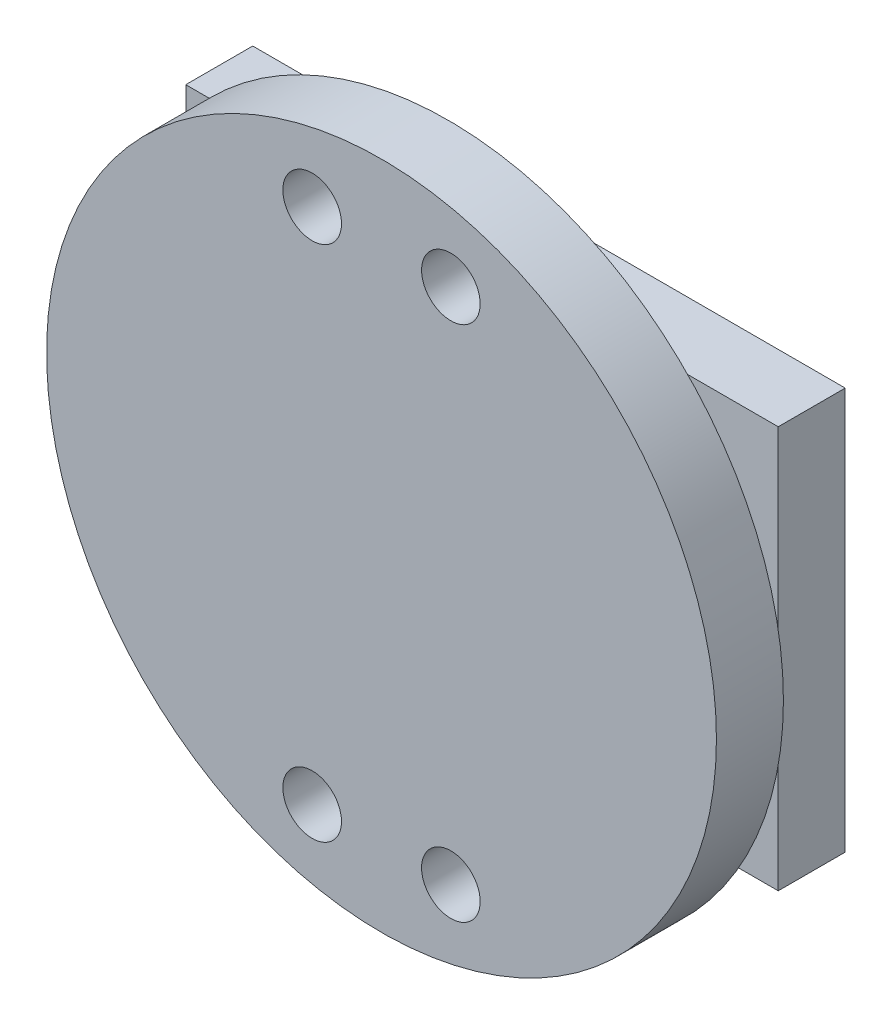
ISO-10303-21;
HEADER;
FILE_DESCRIPTION(('STEP AP214'),'2;1');
FILE_NAME('part.step','',(''),(''),'','','');
FILE_SCHEMA(('AUTOMOTIVE_DESIGN { 1 0 10303 214 1 1 1 1 }'));
ENDSEC;
DATA;
#1=APPLICATION_CONTEXT('core data for automotive mechanical design processes');
#2=APPLICATION_PROTOCOL_DEFINITION('international standard','automotive_design',2000,#1);
#3=PRODUCT_CONTEXT('',#1,'mechanical');
#4=PRODUCT('Part','Part','',(#3));
#5=PRODUCT_RELATED_PRODUCT_CATEGORY('part','',(#4));
#6=PRODUCT_DEFINITION_FORMATION('','',#4);
#7=PRODUCT_DEFINITION_CONTEXT('part definition',#1,'design');
#8=PRODUCT_DEFINITION('design','',#6,#7);
#9=PRODUCT_DEFINITION_SHAPE('','',#8);
#10=(LENGTH_UNIT() NAMED_UNIT(*) SI_UNIT(.MILLI.,.METRE.));
#11=(NAMED_UNIT(*) PLANE_ANGLE_UNIT() SI_UNIT($,.RADIAN.));
#12=(NAMED_UNIT(*) SI_UNIT($,.STERADIAN.) SOLID_ANGLE_UNIT());
#13=UNCERTAINTY_MEASURE_WITH_UNIT(LENGTH_MEASURE(1.E-05),#10,'distance_accuracy_value','');
#14=(GEOMETRIC_REPRESENTATION_CONTEXT(3) GLOBAL_UNCERTAINTY_ASSIGNED_CONTEXT((#13)) GLOBAL_UNIT_ASSIGNED_CONTEXT((#10,
#11,#12)) REPRESENTATION_CONTEXT('',''));
#15=CARTESIAN_POINT('',(0.,0.,0.));
#16=DIRECTION('',(0.,0.,1.));
#17=DIRECTION('',(1.,0.,0.));
#18=AXIS2_PLACEMENT_3D('',#15,#16,#17);
#19=CARTESIAN_POINT('',(0.,0.,4.));
#20=DIRECTION('',(1.,0.,0.));
#21=DIRECTION('',(0.,0.,-1.));
#22=AXIS2_PLACEMENT_3D('',#19,#20,#21);
#23=PLANE('',#22);
#24=DIRECTION('',(0.,-1.,0.));
#25=VECTOR('',#24,1.);
#26=CARTESIAN_POINT('',(0.,0.,0.));
#27=LINE('',#26,#25);
#28=CARTESIAN_POINT('',(0.,0.,0.));
#29=VERTEX_POINT('',#28);
#30=CARTESIAN_POINT('',(0.,-24.,0.));
#31=VERTEX_POINT('',#30);
#32=EDGE_CURVE('E101',#29,#31,#27,.T.);
#33=ORIENTED_EDGE('',*,*,#32,.T.);
#34=DIRECTION('',(0.,0.,-1.));
#35=VECTOR('',#34,1.);
#36=CARTESIAN_POINT('',(0.,-24.,4.));
#37=LINE('',#36,#35);
#38=CARTESIAN_POINT('',(0.,-24.,4.));
#39=VERTEX_POINT('',#38);
#40=EDGE_CURVE('E38',#39,#31,#37,.T.);
#41=ORIENTED_EDGE('',*,*,#40,.F.);
#42=DIRECTION('',(0.,-1.,0.));
#43=VECTOR('',#42,1.);
#44=CARTESIAN_POINT('',(0.,0.,4.));
#45=LINE('',#44,#43);
#46=CARTESIAN_POINT('',(0.,0.,4.));
#47=VERTEX_POINT('',#46);
#48=EDGE_CURVE('E88',#47,#39,#45,.T.);
#49=ORIENTED_EDGE('',*,*,#48,.F.);
#50=DIRECTION('',(0.,0.,-1.));
#51=VECTOR('',#50,1.);
#52=CARTESIAN_POINT('',(0.,0.,4.));
#53=LINE('',#52,#51);
#54=EDGE_CURVE('E97',#47,#29,#53,.T.);
#55=ORIENTED_EDGE('',*,*,#54,.T.);
#56=EDGE_LOOP('',(#33,#41,#49,#55));
#57=FACE_BOUND('',#56,.T.);
#58=ADVANCED_FACE('F35',(#57),#23,.F.);
#59=CARTESIAN_POINT('',(0.,-24.,4.));
#60=DIRECTION('',(0.,1.,0.));
#61=DIRECTION('',(0.,0.,1.));
#62=AXIS2_PLACEMENT_3D('',#59,#60,#61);
#63=PLANE('',#62);
#64=DIRECTION('',(1.,0.,0.));
#65=VECTOR('',#64,1.);
#66=CARTESIAN_POINT('',(0.,-24.,0.));
#67=LINE('',#66,#65);
#68=CARTESIAN_POINT('',(35.38,-24.,0.));
#69=VERTEX_POINT('',#68);
#70=EDGE_CURVE('E93',#31,#69,#67,.T.);
#71=ORIENTED_EDGE('',*,*,#70,.T.);
#72=DIRECTION('',(0.,0.,-1.));
#73=VECTOR('',#72,1.);
#74=CARTESIAN_POINT('',(35.38,-24.,4.));
#75=LINE('',#74,#73);
#76=CARTESIAN_POINT('',(35.38,-24.,4.));
#77=VERTEX_POINT('',#76);
#78=EDGE_CURVE('E91',#77,#69,#75,.T.);
#79=ORIENTED_EDGE('',*,*,#78,.F.);
#80=DIRECTION('',(1.,0.,0.));
#81=VECTOR('',#80,1.);
#82=CARTESIAN_POINT('',(0.,-24.,4.));
#83=LINE('',#82,#81);
#84=EDGE_CURVE('E83',#39,#77,#83,.T.);
#85=ORIENTED_EDGE('',*,*,#84,.F.);
#86=ORIENTED_EDGE('',*,*,#40,.T.);
#87=EDGE_LOOP('',(#71,#79,#85,#86));
#88=FACE_BOUND('',#87,.T.);
#89=ADVANCED_FACE('F92',(#88),#63,.F.);
#90=CARTESIAN_POINT('',(35.38,0.,4.));
#91=DIRECTION('',(-1.,0.,0.));
#92=DIRECTION('',(0.,-1.,0.));
#93=AXIS2_PLACEMENT_3D('',#90,#91,#92);
#94=PLANE('',#93);
#95=DIRECTION('',(0.,1.,0.));
#96=VECTOR('',#95,1.);
#97=CARTESIAN_POINT('',(35.38,0.,0.));
#98=LINE('',#97,#96);
#99=CARTESIAN_POINT('',(35.38,0.,0.));
#100=VERTEX_POINT('',#99);
#101=EDGE_CURVE('E69',#69,#100,#98,.T.);
#102=ORIENTED_EDGE('',*,*,#101,.T.);
#103=DIRECTION('',(0.,0.,-1.));
#104=VECTOR('',#103,1.);
#105=CARTESIAN_POINT('',(35.38,0.,4.));
#106=LINE('',#105,#104);
#107=CARTESIAN_POINT('',(35.38,0.,4.));
#108=VERTEX_POINT('',#107);
#109=EDGE_CURVE('E94',#108,#100,#106,.T.);
#110=ORIENTED_EDGE('',*,*,#109,.F.);
#111=DIRECTION('',(0.,1.,0.));
#112=VECTOR('',#111,1.);
#113=CARTESIAN_POINT('',(35.38,0.,4.));
#114=LINE('',#113,#112);
#115=EDGE_CURVE('E86',#77,#108,#114,.T.);
#116=ORIENTED_EDGE('',*,*,#115,.F.);
#117=ORIENTED_EDGE('',*,*,#78,.T.);
#118=EDGE_LOOP('',(#102,#110,#116,#117));
#119=FACE_BOUND('',#118,.T.);
#120=ADVANCED_FACE('F95',(#119),#94,.F.);
#121=CARTESIAN_POINT('',(0.,0.,4.));
#122=DIRECTION('',(0.,-1.,0.));
#123=DIRECTION('',(0.,0.,-1.));
#124=AXIS2_PLACEMENT_3D('',#121,#122,#123);
#125=PLANE('',#124);
#126=DIRECTION('',(-1.,0.,0.));
#127=VECTOR('',#126,1.);
#128=CARTESIAN_POINT('',(0.,0.,0.));
#129=LINE('',#128,#127);
#130=EDGE_CURVE('E75',#100,#29,#129,.T.);
#131=ORIENTED_EDGE('',*,*,#130,.T.);
#132=ORIENTED_EDGE('',*,*,#54,.F.);
#133=DIRECTION('',(-1.,0.,0.));
#134=VECTOR('',#133,1.);
#135=CARTESIAN_POINT('',(0.,0.,4.));
#136=LINE('',#135,#134);
#137=EDGE_CURVE('E52',#108,#47,#136,.T.);
#138=ORIENTED_EDGE('',*,*,#137,.F.);
#139=ORIENTED_EDGE('',*,*,#109,.T.);
#140=EDGE_LOOP('',(#131,#132,#138,#139));
#141=FACE_BOUND('',#140,.T.);
#142=ADVANCED_FACE('F109',(#141),#125,.F.);
#143=CARTESIAN_POINT('',(0.,0.,4.));
#144=DIRECTION('',(0.,0.,1.));
#145=DIRECTION('',(1.,0.,0.));
#146=AXIS2_PLACEMENT_3D('',#143,#144,#145);
#147=PLANE('',#146);
#148=CARTESIAN_POINT('',(17.69,-12.,4.));
#149=DIRECTION('',(0.,0.,1.));
#150=DIRECTION('',(1.,0.,0.));
#151=AXIS2_PLACEMENT_3D('',#148,#149,#150);
#152=CIRCLE('',#151,10.);
#153=CARTESIAN_POINT('',(27.69,-12.,4.));
#154=VERTEX_POINT('',#153);
#155=EDGE_CURVE('E11',#154,#154,#152,.T.);
#156=ORIENTED_EDGE('',*,*,#155,.F.);
#157=EDGE_LOOP('',(#156));
#158=FACE_BOUND('',#157,.T.);
#159=ORIENTED_EDGE('',*,*,#48,.T.);
#160=ORIENTED_EDGE('',*,*,#84,.T.);
#161=ORIENTED_EDGE('',*,*,#115,.T.);
#162=ORIENTED_EDGE('',*,*,#137,.T.);
#163=EDGE_LOOP('',(#159,#160,#161,#162));
#164=FACE_BOUND('',#163,.T.);
#165=ADVANCED_FACE('F84',(#158,#164),#147,.T.);
#166=CARTESIAN_POINT('',(0.,0.,0.));
#167=DIRECTION('',(0.,0.,1.));
#168=DIRECTION('',(1.,0.,0.));
#169=AXIS2_PLACEMENT_3D('',#166,#167,#168);
#170=PLANE('',#169);
#171=ORIENTED_EDGE('',*,*,#32,.F.);
#172=ORIENTED_EDGE('',*,*,#130,.F.);
#173=ORIENTED_EDGE('',*,*,#101,.F.);
#174=ORIENTED_EDGE('',*,*,#70,.F.);
#175=EDGE_LOOP('',(#171,#172,#173,#174));
#176=FACE_BOUND('',#175,.T.);
#177=ADVANCED_FACE('F112',(#176),#170,.F.);
#178=CARTESIAN_POINT('',(17.69,-12.,6.));
#179=DIRECTION('',(0.,0.,-1.));
#180=DIRECTION('',(-1.,0.,0.));
#181=AXIS2_PLACEMENT_3D('',#178,#179,#180);
#182=CYLINDRICAL_SURFACE('',#181,10.);
#183=CARTESIAN_POINT('',(17.69,-12.,6.));
#184=DIRECTION('',(0.,0.,1.));
#185=DIRECTION('',(1.,0.,0.));
#186=AXIS2_PLACEMENT_3D('',#183,#184,#185);
#187=CIRCLE('',#186,10.);
#188=CARTESIAN_POINT('',(27.69,-12.,6.));
#189=VERTEX_POINT('',#188);
#190=EDGE_CURVE('E104',#189,#189,#187,.T.);
#191=ORIENTED_EDGE('',*,*,#190,.F.);
#192=EDGE_LOOP('',(#191));
#193=FACE_BOUND('',#192,.T.);
#194=ORIENTED_EDGE('',*,*,#155,.T.);
#195=EDGE_LOOP('',(#194));
#196=FACE_BOUND('',#195,.T.);
#197=ADVANCED_FACE('F165',(#193,#196),#182,.T.);
#198=CARTESIAN_POINT('',(17.69,-12.,10.));
#199=DIRECTION('',(0.,0.,-1.));
#200=DIRECTION('',(-1.,0.,0.));
#201=AXIS2_PLACEMENT_3D('',#198,#199,#200);
#202=CYLINDRICAL_SURFACE('',#201,20.);
#203=CARTESIAN_POINT('',(17.69,-12.,10.));
#204=DIRECTION('',(0.,0.,1.));
#205=DIRECTION('',(1.,0.,0.));
#206=AXIS2_PLACEMENT_3D('',#203,#204,#205);
#207=CIRCLE('',#206,20.);
#208=CARTESIAN_POINT('',(37.69,-12.,10.));
#209=VERTEX_POINT('',#208);
#210=EDGE_CURVE('E117',#209,#209,#207,.T.);
#211=ORIENTED_EDGE('',*,*,#210,.F.);
#212=EDGE_LOOP('',(#211));
#213=FACE_BOUND('',#212,.T.);
#214=CARTESIAN_POINT('',(17.69,-12.,6.));
#215=DIRECTION('',(0.,0.,1.));
#216=DIRECTION('',(1.,0.,0.));
#217=AXIS2_PLACEMENT_3D('',#214,#215,#216);
#218=CIRCLE('',#217,20.);
#219=CARTESIAN_POINT('',(37.69,-12.,6.));
#220=VERTEX_POINT('',#219);
#221=EDGE_CURVE('E118',#220,#220,#218,.T.);
#222=ORIENTED_EDGE('',*,*,#221,.T.);
#223=EDGE_LOOP('',(#222));
#224=FACE_BOUND('',#223,.T.);
#225=ADVANCED_FACE('F163',(#213,#224),#202,.T.);
#226=CARTESIAN_POINT('',(17.69,-12.,10.));
#227=DIRECTION('',(0.,0.,1.));
#228=DIRECTION('',(1.,0.,0.));
#229=AXIS2_PLACEMENT_3D('',#226,#227,#228);
#230=PLANE('',#229);
#231=CARTESIAN_POINT('',(21.8311047216403,3.45481322062509,10.));
#232=DIRECTION('',(0.,0.,1.));
#233=DIRECTION('',(1.,0.,0.));
#234=AXIS2_PLACEMENT_3D('',#231,#232,#233);
#235=CIRCLE('',#234,1.75);
#236=CARTESIAN_POINT('',(23.5811047216403,3.45481322062509,10.));
#237=VERTEX_POINT('',#236);
#238=EDGE_CURVE('E121',#237,#237,#235,.T.);
#239=ORIENTED_EDGE('',*,*,#238,.F.);
#240=EDGE_LOOP('',(#239));
#241=FACE_BOUND('',#240,.T.);
#242=CARTESIAN_POINT('',(13.5488952783597,-27.4548132206251,10.));
#243=DIRECTION('',(0.,0.,1.));
#244=DIRECTION('',(1.,0.,0.));
#245=AXIS2_PLACEMENT_3D('',#242,#243,#244);
#246=CIRCLE('',#245,1.75);
#247=CARTESIAN_POINT('',(15.2988952783597,-27.4548132206251,10.));
#248=VERTEX_POINT('',#247);
#249=EDGE_CURVE('E126',#248,#248,#246,.T.);
#250=ORIENTED_EDGE('',*,*,#249,.F.);
#251=EDGE_LOOP('',(#250));
#252=FACE_BOUND('',#251,.T.);
#253=CARTESIAN_POINT('',(21.8311047216403,-27.4548132206251,10.));
#254=DIRECTION('',(0.,0.,1.));
#255=DIRECTION('',(1.,0.,0.));
#256=AXIS2_PLACEMENT_3D('',#253,#254,#255);
#257=CIRCLE('',#256,1.75);
#258=CARTESIAN_POINT('',(23.5811047216403,-27.4548132206251,10.));
#259=VERTEX_POINT('',#258);
#260=EDGE_CURVE('E129',#259,#259,#257,.T.);
#261=ORIENTED_EDGE('',*,*,#260,.F.);
#262=EDGE_LOOP('',(#261));
#263=FACE_BOUND('',#262,.T.);
#264=CARTESIAN_POINT('',(13.5488952783597,3.45481322062509,10.));
#265=DIRECTION('',(0.,0.,1.));
#266=DIRECTION('',(1.,0.,0.));
#267=AXIS2_PLACEMENT_3D('',#264,#265,#266);
#268=CIRCLE('',#267,1.75);
#269=CARTESIAN_POINT('',(15.2988952783597,3.45481322062509,10.));
#270=VERTEX_POINT('',#269);
#271=EDGE_CURVE('E132',#270,#270,#268,.T.);
#272=ORIENTED_EDGE('',*,*,#271,.F.);
#273=EDGE_LOOP('',(#272));
#274=FACE_BOUND('',#273,.T.);
#275=ORIENTED_EDGE('',*,*,#210,.T.);
#276=EDGE_LOOP('',(#275));
#277=FACE_BOUND('',#276,.T.);
#278=ADVANCED_FACE('F154',(#241,#252,#263,#274,#277),#230,.T.);
#279=CARTESIAN_POINT('',(17.69,-12.,6.));
#280=DIRECTION('',(0.,0.,1.));
#281=DIRECTION('',(1.,0.,0.));
#282=AXIS2_PLACEMENT_3D('',#279,#280,#281);
#283=PLANE('',#282);
#284=CARTESIAN_POINT('',(21.8311047216403,3.45481322062509,6.));
#285=DIRECTION('',(0.,0.,-1.));
#286=DIRECTION('',(1.,0.,0.));
#287=AXIS2_PLACEMENT_3D('',#284,#285,#286);
#288=CIRCLE('',#287,1.75);
#289=CARTESIAN_POINT('',(23.5811047216403,3.45481322062509,6.));
#290=VERTEX_POINT('',#289);
#291=EDGE_CURVE('E138',#290,#290,#288,.T.);
#292=ORIENTED_EDGE('',*,*,#291,.F.);
#293=EDGE_LOOP('',(#292));
#294=FACE_BOUND('',#293,.T.);
#295=CARTESIAN_POINT('',(13.5488952783597,-27.4548132206251,6.));
#296=DIRECTION('',(0.,0.,-1.));
#297=DIRECTION('',(1.,0.,0.));
#298=AXIS2_PLACEMENT_3D('',#295,#296,#297);
#299=CIRCLE('',#298,1.75);
#300=CARTESIAN_POINT('',(15.2988952783597,-27.4548132206251,6.));
#301=VERTEX_POINT('',#300);
#302=EDGE_CURVE('E139',#301,#301,#299,.T.);
#303=ORIENTED_EDGE('',*,*,#302,.F.);
#304=EDGE_LOOP('',(#303));
#305=FACE_BOUND('',#304,.T.);
#306=CARTESIAN_POINT('',(21.8311047216403,-27.4548132206251,6.));
#307=DIRECTION('',(0.,0.,-1.));
#308=DIRECTION('',(-1.,0.,0.));
#309=AXIS2_PLACEMENT_3D('',#306,#307,#308);
#310=CIRCLE('',#309,1.75);
#311=CARTESIAN_POINT('',(20.0811047216404,-27.4548132206251,6.));
#312=VERTEX_POINT('',#311);
#313=EDGE_CURVE('E142',#312,#312,#310,.T.);
#314=ORIENTED_EDGE('',*,*,#313,.F.);
#315=EDGE_LOOP('',(#314));
#316=FACE_BOUND('',#315,.T.);
#317=CARTESIAN_POINT('',(13.5488952783597,3.45481322062509,6.));
#318=DIRECTION('',(0.,0.,-1.));
#319=DIRECTION('',(-1.,0.,0.));
#320=AXIS2_PLACEMENT_3D('',#317,#318,#319);
#321=CIRCLE('',#320,1.75);
#322=CARTESIAN_POINT('',(11.7988952783597,3.45481322062509,6.));
#323=VERTEX_POINT('',#322);
#324=EDGE_CURVE('E135',#323,#323,#321,.T.);
#325=ORIENTED_EDGE('',*,*,#324,.F.);
#326=EDGE_LOOP('',(#325));
#327=FACE_BOUND('',#326,.T.);
#328=ORIENTED_EDGE('',*,*,#190,.T.);
#329=EDGE_LOOP('',(#328));
#330=FACE_BOUND('',#329,.T.);
#331=ORIENTED_EDGE('',*,*,#221,.F.);
#332=EDGE_LOOP('',(#331));
#333=FACE_BOUND('',#332,.T.);
#334=ADVANCED_FACE('F150',(#294,#305,#316,#327,#330,#333),#283,.F.);
#335=CARTESIAN_POINT('',(13.5488952783597,3.45481322062509,16.));
#336=DIRECTION('',(0.,0.,-1.));
#337=DIRECTION('',(-1.,0.,0.));
#338=AXIS2_PLACEMENT_3D('',#335,#336,#337);
#339=CYLINDRICAL_SURFACE('',#338,1.75);
#340=ORIENTED_EDGE('',*,*,#271,.T.);
#341=EDGE_LOOP('',(#340));
#342=FACE_BOUND('',#341,.T.);
#343=ORIENTED_EDGE('',*,*,#324,.T.);
#344=EDGE_LOOP('',(#343));
#345=FACE_BOUND('',#344,.T.);
#346=ADVANCED_FACE('F153',(#342,#345),#339,.F.);
#347=CARTESIAN_POINT('',(21.8311047216403,-27.4548132206251,16.));
#348=DIRECTION('',(0.,0.,-1.));
#349=DIRECTION('',(-1.,0.,0.));
#350=AXIS2_PLACEMENT_3D('',#347,#348,#349);
#351=CYLINDRICAL_SURFACE('',#350,1.75);
#352=ORIENTED_EDGE('',*,*,#260,.T.);
#353=EDGE_LOOP('',(#352));
#354=FACE_BOUND('',#353,.T.);
#355=ORIENTED_EDGE('',*,*,#313,.T.);
#356=EDGE_LOOP('',(#355));
#357=FACE_BOUND('',#356,.T.);
#358=ADVANCED_FACE('F148',(#354,#357),#351,.F.);
#359=CARTESIAN_POINT('',(13.5488952783597,-27.4548132206251,16.));
#360=DIRECTION('',(0.,0.,-1.));
#361=DIRECTION('',(-1.,0.,0.));
#362=AXIS2_PLACEMENT_3D('',#359,#360,#361);
#363=CYLINDRICAL_SURFACE('',#362,1.75);
#364=ORIENTED_EDGE('',*,*,#249,.T.);
#365=EDGE_LOOP('',(#364));
#366=FACE_BOUND('',#365,.T.);
#367=ORIENTED_EDGE('',*,*,#302,.T.);
#368=EDGE_LOOP('',(#367));
#369=FACE_BOUND('',#368,.T.);
#370=ADVANCED_FACE('F240',(#366,#369),#363,.F.);
#371=CARTESIAN_POINT('',(21.8311047216403,3.45481322062509,16.));
#372=DIRECTION('',(0.,0.,-1.));
#373=DIRECTION('',(-1.,0.,0.));
#374=AXIS2_PLACEMENT_3D('',#371,#372,#373);
#375=CYLINDRICAL_SURFACE('',#374,1.75);
#376=ORIENTED_EDGE('',*,*,#238,.T.);
#377=EDGE_LOOP('',(#376));
#378=FACE_BOUND('',#377,.T.);
#379=ORIENTED_EDGE('',*,*,#291,.T.);
#380=EDGE_LOOP('',(#379));
#381=FACE_BOUND('',#380,.T.);
#382=ADVANCED_FACE('F250',(#378,#381),#375,.F.);
#383=CLOSED_SHELL('',(#58,#89,#120,#142,#165,#177,#197,#225,#278,#334,#346,#358,#370,#382));
#384=MANIFOLD_SOLID_BREP('B2',#383);
#385=ADVANCED_BREP_SHAPE_REPRESENTATION('',(#18,#384),#14);
#386=SHAPE_DEFINITION_REPRESENTATION(#9,#385);
ENDSEC;
END-ISO-10303-21;
